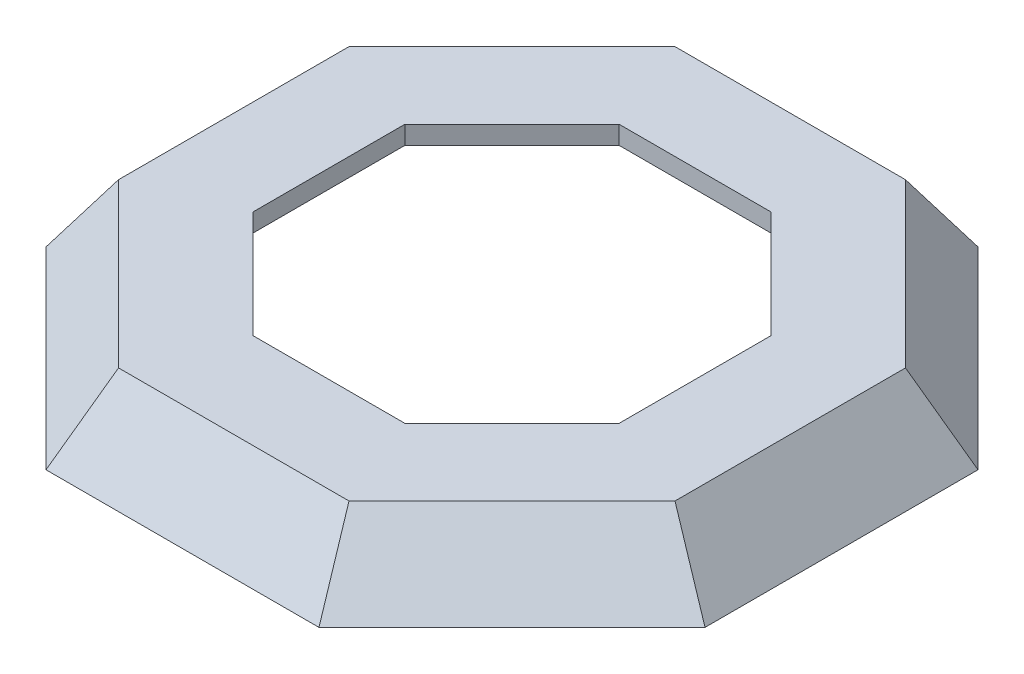
ISO-10303-21;
HEADER;
FILE_DESCRIPTION(('STEP AP214'),'2;1');
FILE_NAME('part.step','',(''),(''),'','','');
FILE_SCHEMA(('AUTOMOTIVE_DESIGN { 1 0 10303 214 1 1 1 1 }'));
ENDSEC;
DATA;
#1=APPLICATION_CONTEXT('core data for automotive mechanical design processes');
#2=APPLICATION_PROTOCOL_DEFINITION('international standard','automotive_design',2000,#1);
#3=PRODUCT_CONTEXT('',#1,'mechanical');
#4=PRODUCT('Part','Part','',(#3));
#5=PRODUCT_RELATED_PRODUCT_CATEGORY('part','',(#4));
#6=PRODUCT_DEFINITION_FORMATION('','',#4);
#7=PRODUCT_DEFINITION_CONTEXT('part definition',#1,'design');
#8=PRODUCT_DEFINITION('design','',#6,#7);
#9=PRODUCT_DEFINITION_SHAPE('','',#8);
#10=(LENGTH_UNIT() NAMED_UNIT(*) SI_UNIT(.MILLI.,.METRE.));
#11=(NAMED_UNIT(*) PLANE_ANGLE_UNIT() SI_UNIT($,.RADIAN.));
#12=(NAMED_UNIT(*) SI_UNIT($,.STERADIAN.) SOLID_ANGLE_UNIT());
#13=UNCERTAINTY_MEASURE_WITH_UNIT(LENGTH_MEASURE(1.E-05),#10,'distance_accuracy_value','');
#14=(GEOMETRIC_REPRESENTATION_CONTEXT(3) GLOBAL_UNCERTAINTY_ASSIGNED_CONTEXT((#13)) GLOBAL_UNIT_ASSIGNED_CONTEXT((#10,
#11,#12)) REPRESENTATION_CONTEXT('',''));
#15=CARTESIAN_POINT('',(0.,0.,0.));
#16=DIRECTION('',(0.,0.,1.));
#17=DIRECTION('',(1.,0.,0.));
#18=AXIS2_PLACEMENT_3D('',#15,#16,#17);
#19=CARTESIAN_POINT('',(0.,20.,0.));
#20=DIRECTION('',(0.,1.,0.));
#21=DIRECTION('',(0.,0.,1.));
#22=AXIS2_PLACEMENT_3D('',#19,#20,#21);
#23=PLANE('',#22);
#24=DIRECTION('',(-0.707106781186548,0.,-0.707106781186547));
#25=VECTOR('',#24,1.);
#26=CARTESIAN_POINT('',(50.,20.,-20.7106781186548));
#27=LINE('',#26,#25);
#28=CARTESIAN_POINT('',(50.,20.,-20.7106781186548));
#29=VERTEX_POINT('',#28);
#30=CARTESIAN_POINT('',(20.7106781186548,20.,-50.));
#31=VERTEX_POINT('',#30);
#32=EDGE_CURVE('E55',#29,#31,#27,.T.);
#33=ORIENTED_EDGE('',*,*,#32,.F.);
#34=DIRECTION('',(0.,0.,-1.));
#35=VECTOR('',#34,1.);
#36=CARTESIAN_POINT('',(50.,20.,20.7106781186548));
#37=LINE('',#36,#35);
#38=CARTESIAN_POINT('',(50.,20.,20.7106781186548));
#39=VERTEX_POINT('',#38);
#40=EDGE_CURVE('E234',#39,#29,#37,.T.);
#41=ORIENTED_EDGE('',*,*,#40,.F.);
#42=DIRECTION('',(0.707106781186547,0.,-0.707106781186548));
#43=VECTOR('',#42,1.);
#44=CARTESIAN_POINT('',(20.7106781186548,20.,50.));
#45=LINE('',#44,#43);
#46=CARTESIAN_POINT('',(20.7106781186548,20.,50.));
#47=VERTEX_POINT('',#46);
#48=EDGE_CURVE('E231',#47,#39,#45,.T.);
#49=ORIENTED_EDGE('',*,*,#48,.F.);
#50=DIRECTION('',(1.,0.,0.));
#51=VECTOR('',#50,1.);
#52=CARTESIAN_POINT('',(-20.7106781186547,20.,50.));
#53=LINE('',#52,#51);
#54=CARTESIAN_POINT('',(-20.7106781186547,20.,50.));
#55=VERTEX_POINT('',#54);
#56=EDGE_CURVE('E228',#55,#47,#53,.T.);
#57=ORIENTED_EDGE('',*,*,#56,.F.);
#58=DIRECTION('',(0.707106781186548,0.,0.707106781186547));
#59=VECTOR('',#58,1.);
#60=CARTESIAN_POINT('',(-50.,20.,20.7106781186548));
#61=LINE('',#60,#59);
#62=CARTESIAN_POINT('',(-50.,20.,20.7106781186548));
#63=VERTEX_POINT('',#62);
#64=EDGE_CURVE('E222',#63,#55,#61,.T.);
#65=ORIENTED_EDGE('',*,*,#64,.F.);
#66=DIRECTION('',(0.,0.,1.));
#67=VECTOR('',#66,1.);
#68=CARTESIAN_POINT('',(-50.,20.,-20.7106781186547));
#69=LINE('',#68,#67);
#70=CARTESIAN_POINT('',(-50.,20.,-20.7106781186547));
#71=VERTEX_POINT('',#70);
#72=EDGE_CURVE('E220',#71,#63,#69,.T.);
#73=ORIENTED_EDGE('',*,*,#72,.F.);
#74=DIRECTION('',(-0.707106781186547,0.,0.707106781186548));
#75=VECTOR('',#74,1.);
#76=CARTESIAN_POINT('',(-20.7106781186548,20.,-50.));
#77=LINE('',#76,#75);
#78=CARTESIAN_POINT('',(-20.7106781186548,20.,-50.));
#79=VERTEX_POINT('',#78);
#80=EDGE_CURVE('E204',#79,#71,#77,.T.);
#81=ORIENTED_EDGE('',*,*,#80,.F.);
#82=DIRECTION('',(-1.,0.,0.));
#83=VECTOR('',#82,1.);
#84=CARTESIAN_POINT('',(20.7106781186548,20.,-50.));
#85=LINE('',#84,#83);
#86=EDGE_CURVE('E213',#31,#79,#85,.T.);
#87=ORIENTED_EDGE('',*,*,#86,.F.);
#88=EDGE_LOOP('',(#33,#41,#49,#57,#65,#73,#81,#87));
#89=FACE_BOUND('',#88,.T.);
#90=DIRECTION('',(0.707106781186548,0.,0.707106781186547));
#91=VECTOR('',#90,1.);
#92=CARTESIAN_POINT('',(-27.376790643458,20.,80.0975700298795));
#93=LINE('',#92,#91);
#94=CARTESIAN_POINT('',(-75.9958492358058,20.,31.4785114375318));
#95=VERTEX_POINT('',#94);
#96=CARTESIAN_POINT('',(-31.4785114375317,20.,75.9958492358058));
#97=VERTEX_POINT('',#96);
#98=EDGE_CURVE('E350',#95,#97,#93,.T.);
#99=ORIENTED_EDGE('',*,*,#98,.T.);
#100=DIRECTION('',(1.,0.,0.));
#101=VECTOR('',#100,1.);
#102=CARTESIAN_POINT('',(37.2792206135786,20.,75.9958492358058));
#103=LINE('',#102,#101);
#104=CARTESIAN_POINT('',(31.4785114375318,20.,75.9958492358058));
#105=VERTEX_POINT('',#104);
#106=EDGE_CURVE('E352',#97,#105,#103,.T.);
#107=ORIENTED_EDGE('',*,*,#106,.T.);
#108=DIRECTION('',(0.707106781186547,0.,-0.707106781186548));
#109=VECTOR('',#108,1.);
#110=CARTESIAN_POINT('',(80.0975700298795,20.,27.3767906434581));
#111=LINE('',#110,#109);
#112=CARTESIAN_POINT('',(75.9958492358059,20.,31.4785114375318));
#113=VERTEX_POINT('',#112);
#114=EDGE_CURVE('E338',#105,#113,#111,.T.);
#115=ORIENTED_EDGE('',*,*,#114,.T.);
#116=DIRECTION('',(0.,0.,-1.));
#117=VECTOR('',#116,1.);
#118=CARTESIAN_POINT('',(75.9958492358058,20.,-37.2792206135786));
#119=LINE('',#118,#117);
#120=CARTESIAN_POINT('',(75.9958492358058,20.,-31.4785114375318));
#121=VERTEX_POINT('',#120);
#122=EDGE_CURVE('E340',#113,#121,#119,.T.);
#123=ORIENTED_EDGE('',*,*,#122,.T.);
#124=DIRECTION('',(-0.707106781186548,0.,-0.707106781186547));
#125=VECTOR('',#124,1.);
#126=CARTESIAN_POINT('',(27.376790643458,20.,-80.0975700298795));
#127=LINE('',#126,#125);
#128=CARTESIAN_POINT('',(31.4785114375317,20.,-75.9958492358058));
#129=VERTEX_POINT('',#128);
#130=EDGE_CURVE('E342',#121,#129,#127,.T.);
#131=ORIENTED_EDGE('',*,*,#130,.T.);
#132=DIRECTION('',(-1.,0.,0.));
#133=VECTOR('',#132,1.);
#134=CARTESIAN_POINT('',(-37.2792206135786,20.,-75.9958492358058));
#135=LINE('',#134,#133);
#136=CARTESIAN_POINT('',(-31.4785114375318,20.,-75.9958492358058));
#137=VERTEX_POINT('',#136);
#138=EDGE_CURVE('E344',#129,#137,#135,.T.);
#139=ORIENTED_EDGE('',*,*,#138,.T.);
#140=DIRECTION('',(-0.707106781186547,0.,0.707106781186548));
#141=VECTOR('',#140,1.);
#142=CARTESIAN_POINT('',(-80.0975700298795,20.,-27.376790643458));
#143=LINE('',#142,#141);
#144=CARTESIAN_POINT('',(-75.9958492358058,20.,-31.4785114375317));
#145=VERTEX_POINT('',#144);
#146=EDGE_CURVE('E346',#137,#145,#143,.T.);
#147=ORIENTED_EDGE('',*,*,#146,.T.);
#148=DIRECTION('',(0.,0.,1.));
#149=VECTOR('',#148,1.);
#150=CARTESIAN_POINT('',(-75.9958492358058,20.,37.2792206135786));
#151=LINE('',#150,#149);
#152=EDGE_CURVE('E348',#145,#95,#151,.T.);
#153=ORIENTED_EDGE('',*,*,#152,.T.);
#154=EDGE_LOOP('',(#99,#107,#115,#123,#131,#139,#147,#153));
#155=FACE_BOUND('',#154,.T.);
#156=ADVANCED_FACE('F39',(#89,#155),#23,.T.);
#157=CARTESIAN_POINT('',(0.,0.,0.));
#158=DIRECTION('',(0.,1.,0.));
#159=DIRECTION('',(0.,0.,1.));
#160=AXIS2_PLACEMENT_3D('',#157,#158,#159);
#161=PLANE('',#160);
#162=DIRECTION('',(1.,0.,0.));
#163=VECTOR('',#162,1.);
#164=CARTESIAN_POINT('',(0.,0.,83.8961270561927));
#165=LINE('',#164,#163);
#166=CARTESIAN_POINT('',(-34.7509136572514,0.,83.8961270561927));
#167=VERTEX_POINT('',#166);
#168=CARTESIAN_POINT('',(34.7509136572514,0.,83.8961270561927));
#169=VERTEX_POINT('',#168);
#170=EDGE_CURVE('E260',#167,#169,#165,.T.);
#171=ORIENTED_EDGE('',*,*,#170,.T.);
#172=DIRECTION('',(0.707106781186547,0.,-0.707106781186548));
#173=VECTOR('',#172,1.);
#174=CARTESIAN_POINT('',(59.3235203567221,0.,59.323520356722));
#175=LINE('',#174,#173);
#176=CARTESIAN_POINT('',(83.8961270561927,0.,34.7509136572514));
#177=VERTEX_POINT('',#176);
#178=EDGE_CURVE('E276',#169,#177,#175,.T.);
#179=ORIENTED_EDGE('',*,*,#178,.T.);
#180=DIRECTION('',(0.,0.,-1.));
#181=VECTOR('',#180,1.);
#182=CARTESIAN_POINT('',(83.8961270561927,0.,0.));
#183=LINE('',#182,#181);
#184=CARTESIAN_POINT('',(83.8961270561927,0.,-34.7509136572514));
#185=VERTEX_POINT('',#184);
#186=EDGE_CURVE('E298',#177,#185,#183,.T.);
#187=ORIENTED_EDGE('',*,*,#186,.T.);
#188=DIRECTION('',(-0.707106781186548,0.,-0.707106781186547));
#189=VECTOR('',#188,1.);
#190=CARTESIAN_POINT('',(59.323520356722,0.,-59.323520356722));
#191=LINE('',#190,#189);
#192=CARTESIAN_POINT('',(34.7509136572513,0.,-83.8961270561927));
#193=VERTEX_POINT('',#192);
#194=EDGE_CURVE('E295',#185,#193,#191,.T.);
#195=ORIENTED_EDGE('',*,*,#194,.T.);
#196=DIRECTION('',(-1.,0.,0.));
#197=VECTOR('',#196,1.);
#198=CARTESIAN_POINT('',(0.,0.,-83.8961270561927));
#199=LINE('',#198,#197);
#200=CARTESIAN_POINT('',(-34.7509136572514,0.,-83.8961270561927));
#201=VERTEX_POINT('',#200);
#202=EDGE_CURVE('E291',#193,#201,#199,.T.);
#203=ORIENTED_EDGE('',*,*,#202,.T.);
#204=DIRECTION('',(-0.707106781186547,0.,0.707106781186548));
#205=VECTOR('',#204,1.);
#206=CARTESIAN_POINT('',(-59.323520356722,0.,-59.323520356722));
#207=LINE('',#206,#205);
#208=CARTESIAN_POINT('',(-83.8961270561927,0.,-34.7509136572514));
#209=VERTEX_POINT('',#208);
#210=EDGE_CURVE('E294',#201,#209,#207,.T.);
#211=ORIENTED_EDGE('',*,*,#210,.T.);
#212=DIRECTION('',(0.,0.,1.));
#213=VECTOR('',#212,1.);
#214=CARTESIAN_POINT('',(-83.8961270561927,0.,0.));
#215=LINE('',#214,#213);
#216=CARTESIAN_POINT('',(-83.8961270561927,0.,34.7509136572514));
#217=VERTEX_POINT('',#216);
#218=EDGE_CURVE('E308',#209,#217,#215,.T.);
#219=ORIENTED_EDGE('',*,*,#218,.T.);
#220=DIRECTION('',(0.707106781186548,0.,0.707106781186547));
#221=VECTOR('',#220,1.);
#222=CARTESIAN_POINT('',(-59.323520356722,0.,59.323520356722));
#223=LINE('',#222,#221);
#224=EDGE_CURVE('E305',#217,#167,#223,.T.);
#225=ORIENTED_EDGE('',*,*,#224,.T.);
#226=EDGE_LOOP('',(#171,#179,#187,#195,#203,#211,#219,#225));
#227=FACE_BOUND('',#226,.T.);
#228=DIRECTION('',(0.707106781186547,0.,-0.707106781186548));
#229=VECTOR('',#228,1.);
#230=CARTESIAN_POINT('',(37.2792206135786,0.,90.));
#231=LINE('',#230,#229);
#232=CARTESIAN_POINT('',(37.2792206135786,0.,90.));
#233=VERTEX_POINT('',#232);
#234=CARTESIAN_POINT('',(90.,0.,37.2792206135785));
#235=VERTEX_POINT('',#234);
#236=EDGE_CURVE('E313',#233,#235,#231,.T.);
#237=ORIENTED_EDGE('',*,*,#236,.F.);
#238=DIRECTION('',(1.,0.,0.));
#239=VECTOR('',#238,1.);
#240=CARTESIAN_POINT('',(-37.2792206135785,0.,90.));
#241=LINE('',#240,#239);
#242=CARTESIAN_POINT('',(-37.2792206135785,0.,90.));
#243=VERTEX_POINT('',#242);
#244=EDGE_CURVE('E335',#243,#233,#241,.T.);
#245=ORIENTED_EDGE('',*,*,#244,.F.);
#246=DIRECTION('',(0.707106781186548,0.,0.707106781186547));
#247=VECTOR('',#246,1.);
#248=CARTESIAN_POINT('',(-90.,0.,37.2792206135786));
#249=LINE('',#248,#247);
#250=CARTESIAN_POINT('',(-90.,0.,37.2792206135786));
#251=VERTEX_POINT('',#250);
#252=EDGE_CURVE('E332',#251,#243,#249,.T.);
#253=ORIENTED_EDGE('',*,*,#252,.F.);
#254=DIRECTION('',(0.,0.,1.));
#255=VECTOR('',#254,1.);
#256=CARTESIAN_POINT('',(-90.,0.,-37.2792206135785));
#257=LINE('',#256,#255);
#258=CARTESIAN_POINT('',(-90.,0.,-37.2792206135785));
#259=VERTEX_POINT('',#258);
#260=EDGE_CURVE('E329',#259,#251,#257,.T.);
#261=ORIENTED_EDGE('',*,*,#260,.F.);
#262=DIRECTION('',(-0.707106781186547,0.,0.707106781186548));
#263=VECTOR('',#262,1.);
#264=CARTESIAN_POINT('',(-37.2792206135786,0.,-90.));
#265=LINE('',#264,#263);
#266=CARTESIAN_POINT('',(-37.2792206135786,0.,-90.));
#267=VERTEX_POINT('',#266);
#268=EDGE_CURVE('E326',#267,#259,#265,.T.);
#269=ORIENTED_EDGE('',*,*,#268,.F.);
#270=DIRECTION('',(-1.,0.,0.));
#271=VECTOR('',#270,1.);
#272=CARTESIAN_POINT('',(37.2792206135785,0.,-90.));
#273=LINE('',#272,#271);
#274=CARTESIAN_POINT('',(37.2792206135785,0.,-90.));
#275=VERTEX_POINT('',#274);
#276=EDGE_CURVE('E323',#275,#267,#273,.T.);
#277=ORIENTED_EDGE('',*,*,#276,.F.);
#278=DIRECTION('',(-0.707106781186548,0.,-0.707106781186547));
#279=VECTOR('',#278,1.);
#280=CARTESIAN_POINT('',(90.,0.,-37.2792206135786));
#281=LINE('',#280,#279);
#282=CARTESIAN_POINT('',(90.,0.,-37.2792206135786));
#283=VERTEX_POINT('',#282);
#284=EDGE_CURVE('E320',#283,#275,#281,.T.);
#285=ORIENTED_EDGE('',*,*,#284,.F.);
#286=DIRECTION('',(0.,0.,-1.));
#287=VECTOR('',#286,1.);
#288=CARTESIAN_POINT('',(90.,0.,37.2792206135785));
#289=LINE('',#288,#287);
#290=EDGE_CURVE('E316',#235,#283,#289,.T.);
#291=ORIENTED_EDGE('',*,*,#290,.F.);
#292=EDGE_LOOP('',(#237,#245,#253,#261,#269,#277,#285,#291));
#293=FACE_BOUND('',#292,.T.);
#294=ADVANCED_FACE('F426',(#227,#293),#161,.F.);
#295=CARTESIAN_POINT('',(0.,20.,-75.9958492358058));
#296=DIRECTION('',(0.,0.573576436351044,-0.819152044288993));
#297=DIRECTION('',(1.,0.,0.));
#298=AXIS2_PLACEMENT_3D('',#295,#296,#297);
#299=PLANE('',#298);
#300=DIRECTION('',(-0.231148998591869,0.79696806571985,0.558043047329448));
#301=VECTOR('',#300,1.);
#302=CARTESIAN_POINT('',(29.7966189925806,25.7989200765185,-71.935401684752));
#303=LINE('',#302,#301);
#304=EDGE_CURVE('E371',#275,#129,#303,.T.);
#305=ORIENTED_EDGE('',*,*,#304,.F.);
#306=ORIENTED_EDGE('',*,*,#276,.T.);
#307=DIRECTION('',(0.231148998591869,0.79696806571985,0.558043047329448));
#308=VECTOR('',#307,1.);
#309=CARTESIAN_POINT('',(-29.7966189925806,25.7989200765185,-71.935401684752));
#310=LINE('',#309,#308);
#311=EDGE_CURVE('E317',#137,#267,#310,.F.);
#312=ORIENTED_EDGE('',*,*,#311,.F.);
#313=ORIENTED_EDGE('',*,*,#138,.F.);
#314=EDGE_LOOP('',(#305,#306,#312,#313));
#315=FACE_BOUND('',#314,.T.);
#316=ADVANCED_FACE('F42',(#315),#299,.T.);
#317=CARTESIAN_POINT('',(-53.7371803366688,20.,-53.7371803366688));
#318=DIRECTION('',(-0.57922796533957,0.573576436351044,-0.57922796533957));
#319=DIRECTION('',(0.707106781186547,0.,-0.707106781186548));
#320=AXIS2_PLACEMENT_3D('',#317,#318,#319);
#321=PLANE('',#320);
#322=ORIENTED_EDGE('',*,*,#311,.T.);
#323=ORIENTED_EDGE('',*,*,#268,.T.);
#324=DIRECTION('',(0.558043047329448,0.79696806571985,0.231148998591869));
#325=VECTOR('',#324,1.);
#326=CARTESIAN_POINT('',(-71.935401684752,25.7989200765185,-29.7966189925806));
#327=LINE('',#326,#325);
#328=EDGE_CURVE('E368',#145,#259,#327,.F.);
#329=ORIENTED_EDGE('',*,*,#328,.F.);
#330=ORIENTED_EDGE('',*,*,#146,.F.);
#331=EDGE_LOOP('',(#322,#323,#329,#330));
#332=FACE_BOUND('',#331,.T.);
#333=ADVANCED_FACE('F476',(#332),#321,.T.);
#334=CARTESIAN_POINT('',(53.7371803366688,20.,-53.7371803366688));
#335=DIRECTION('',(0.57922796533957,0.573576436351044,-0.57922796533957));
#336=DIRECTION('',(0.707106781186548,0.,0.707106781186547));
#337=AXIS2_PLACEMENT_3D('',#334,#335,#336);
#338=PLANE('',#337);
#339=ORIENTED_EDGE('',*,*,#304,.T.);
#340=ORIENTED_EDGE('',*,*,#130,.F.);
#341=DIRECTION('',(-0.558043047329447,0.796968065719851,0.231148998591869));
#342=VECTOR('',#341,1.);
#343=CARTESIAN_POINT('',(71.935401684752,25.7989200765185,-29.7966189925806));
#344=LINE('',#343,#342);
#345=EDGE_CURVE('E365',#283,#121,#344,.T.);
#346=ORIENTED_EDGE('',*,*,#345,.F.);
#347=ORIENTED_EDGE('',*,*,#284,.T.);
#348=EDGE_LOOP('',(#339,#340,#346,#347));
#349=FACE_BOUND('',#348,.T.);
#350=ADVANCED_FACE('F470',(#349),#338,.T.);
#351=CARTESIAN_POINT('',(-75.9958492358058,20.,0.));
#352=DIRECTION('',(-0.819152044288993,0.573576436351044,0.));
#353=DIRECTION('',(0.,0.,-1.));
#354=AXIS2_PLACEMENT_3D('',#351,#352,#353);
#355=PLANE('',#354);
#356=ORIENTED_EDGE('',*,*,#328,.T.);
#357=ORIENTED_EDGE('',*,*,#260,.T.);
#358=DIRECTION('',(0.558043047329448,0.79696806571985,-0.231148998591869));
#359=VECTOR('',#358,1.);
#360=CARTESIAN_POINT('',(-71.935401684752,25.7989200765185,29.7966189925806));
#361=LINE('',#360,#359);
#362=EDGE_CURVE('E362',#95,#251,#361,.F.);
#363=ORIENTED_EDGE('',*,*,#362,.F.);
#364=ORIENTED_EDGE('',*,*,#152,.F.);
#365=EDGE_LOOP('',(#356,#357,#363,#364));
#366=FACE_BOUND('',#365,.T.);
#367=ADVANCED_FACE('F463',(#366),#355,.T.);
#368=CARTESIAN_POINT('',(75.9958492358058,20.,0.));
#369=DIRECTION('',(0.819152044288993,0.573576436351044,0.));
#370=DIRECTION('',(0.,0.,1.));
#371=AXIS2_PLACEMENT_3D('',#368,#369,#370);
#372=PLANE('',#371);
#373=ORIENTED_EDGE('',*,*,#345,.T.);
#374=ORIENTED_EDGE('',*,*,#122,.F.);
#375=DIRECTION('',(-0.558043047329448,0.796968065719851,-0.231148998591869));
#376=VECTOR('',#375,1.);
#377=CARTESIAN_POINT('',(71.935401684752,25.7989200765185,29.7966189925806));
#378=LINE('',#377,#376);
#379=EDGE_CURVE('E359',#235,#113,#378,.T.);
#380=ORIENTED_EDGE('',*,*,#379,.F.);
#381=ORIENTED_EDGE('',*,*,#290,.T.);
#382=EDGE_LOOP('',(#373,#374,#380,#381));
#383=FACE_BOUND('',#382,.T.);
#384=ADVANCED_FACE('F456',(#383),#372,.T.);
#385=CARTESIAN_POINT('',(-53.7371803366688,20.,53.7371803366688));
#386=DIRECTION('',(-0.57922796533957,0.573576436351044,0.57922796533957));
#387=DIRECTION('',(-0.707106781186548,0.,-0.707106781186547));
#388=AXIS2_PLACEMENT_3D('',#385,#386,#387);
#389=PLANE('',#388);
#390=ORIENTED_EDGE('',*,*,#362,.T.);
#391=ORIENTED_EDGE('',*,*,#252,.T.);
#392=DIRECTION('',(0.231148998591869,0.796968065719851,-0.558043047329447));
#393=VECTOR('',#392,1.);
#394=CARTESIAN_POINT('',(-29.7966189925806,25.7989200765185,71.935401684752));
#395=LINE('',#394,#393);
#396=EDGE_CURVE('E357',#97,#243,#395,.F.);
#397=ORIENTED_EDGE('',*,*,#396,.F.);
#398=ORIENTED_EDGE('',*,*,#98,.F.);
#399=EDGE_LOOP('',(#390,#391,#397,#398));
#400=FACE_BOUND('',#399,.T.);
#401=ADVANCED_FACE('F449',(#400),#389,.T.);
#402=CARTESIAN_POINT('',(53.7371803366688,20.,53.7371803366688));
#403=DIRECTION('',(0.57922796533957,0.573576436351044,0.57922796533957));
#404=DIRECTION('',(-0.707106781186547,0.,0.707106781186548));
#405=AXIS2_PLACEMENT_3D('',#402,#403,#404);
#406=PLANE('',#405);
#407=ORIENTED_EDGE('',*,*,#379,.T.);
#408=ORIENTED_EDGE('',*,*,#114,.F.);
#409=DIRECTION('',(0.231148998591869,-0.796968065719851,0.558043047329447));
#410=VECTOR('',#409,1.);
#411=CARTESIAN_POINT('',(29.7966189925807,25.7989200765185,71.935401684752));
#412=LINE('',#411,#410);
#413=EDGE_CURVE('E256',#233,#105,#412,.F.);
#414=ORIENTED_EDGE('',*,*,#413,.F.);
#415=ORIENTED_EDGE('',*,*,#236,.T.);
#416=EDGE_LOOP('',(#407,#408,#414,#415));
#417=FACE_BOUND('',#416,.T.);
#418=ADVANCED_FACE('F442',(#417),#406,.T.);
#419=CARTESIAN_POINT('',(0.,20.,75.9958492358058));
#420=DIRECTION('',(0.,0.573576436351044,0.819152044288993));
#421=DIRECTION('',(-1.,0.,0.));
#422=AXIS2_PLACEMENT_3D('',#419,#420,#421);
#423=PLANE('',#422);
#424=ORIENTED_EDGE('',*,*,#396,.T.);
#425=ORIENTED_EDGE('',*,*,#244,.T.);
#426=ORIENTED_EDGE('',*,*,#413,.T.);
#427=ORIENTED_EDGE('',*,*,#106,.F.);
#428=EDGE_LOOP('',(#424,#425,#426,#427));
#429=FACE_BOUND('',#428,.T.);
#430=ADVANCED_FACE('F436',(#429),#423,.T.);
#431=CARTESIAN_POINT('',(0.,15.,0.));
#432=DIRECTION('',(0.,1.,0.));
#433=DIRECTION('',(0.,0.,1.));
#434=AXIS2_PLACEMENT_3D('',#431,#432,#433);
#435=PLANE('',#434);
#436=DIRECTION('',(0.,0.,-1.));
#437=VECTOR('',#436,1.);
#438=CARTESIAN_POINT('',(50.,15.,0.));
#439=LINE('',#438,#437);
#440=CARTESIAN_POINT('',(50.,15.,20.7106781186548));
#441=VERTEX_POINT('',#440);
#442=CARTESIAN_POINT('',(50.,15.,-20.7106781186548));
#443=VERTEX_POINT('',#442);
#444=EDGE_CURVE('E48',#441,#443,#439,.T.);
#445=ORIENTED_EDGE('',*,*,#444,.T.);
#446=DIRECTION('',(-0.707106781186548,0.,-0.707106781186547));
#447=VECTOR('',#446,1.);
#448=CARTESIAN_POINT('',(35.3553390593274,15.,-35.3553390593274));
#449=LINE('',#448,#447);
#450=CARTESIAN_POINT('',(20.7106781186548,15.,-50.));
#451=VERTEX_POINT('',#450);
#452=EDGE_CURVE('E11',#443,#451,#449,.T.);
#453=ORIENTED_EDGE('',*,*,#452,.T.);
#454=DIRECTION('',(-1.,0.,0.));
#455=VECTOR('',#454,1.);
#456=CARTESIAN_POINT('',(0.,15.,-50.));
#457=LINE('',#456,#455);
#458=CARTESIAN_POINT('',(-20.7106781186548,15.,-50.));
#459=VERTEX_POINT('',#458);
#460=EDGE_CURVE('E355',#451,#459,#457,.T.);
#461=ORIENTED_EDGE('',*,*,#460,.T.);
#462=DIRECTION('',(-0.707106781186547,0.,0.707106781186548));
#463=VECTOR('',#462,1.);
#464=CARTESIAN_POINT('',(-35.3553390593274,15.,-35.3553390593274));
#465=LINE('',#464,#463);
#466=CARTESIAN_POINT('',(-50.,15.,-20.7106781186547));
#467=VERTEX_POINT('',#466);
#468=EDGE_CURVE('E207',#459,#467,#465,.T.);
#469=ORIENTED_EDGE('',*,*,#468,.T.);
#470=DIRECTION('',(0.,0.,1.));
#471=VECTOR('',#470,1.);
#472=CARTESIAN_POINT('',(-50.,15.,0.));
#473=LINE('',#472,#471);
#474=CARTESIAN_POINT('',(-50.,15.,20.7106781186548));
#475=VERTEX_POINT('',#474);
#476=EDGE_CURVE('E378',#467,#475,#473,.T.);
#477=ORIENTED_EDGE('',*,*,#476,.T.);
#478=DIRECTION('',(0.707106781186548,0.,0.707106781186547));
#479=VECTOR('',#478,1.);
#480=CARTESIAN_POINT('',(-35.3553390593274,15.,35.3553390593274));
#481=LINE('',#480,#479);
#482=CARTESIAN_POINT('',(-20.7106781186547,15.,50.));
#483=VERTEX_POINT('',#482);
#484=EDGE_CURVE('E381',#475,#483,#481,.T.);
#485=ORIENTED_EDGE('',*,*,#484,.T.);
#486=DIRECTION('',(1.,0.,0.));
#487=VECTOR('',#486,1.);
#488=CARTESIAN_POINT('',(0.,15.,50.));
#489=LINE('',#488,#487);
#490=CARTESIAN_POINT('',(20.7106781186548,15.,50.));
#491=VERTEX_POINT('',#490);
#492=EDGE_CURVE('E384',#483,#491,#489,.T.);
#493=ORIENTED_EDGE('',*,*,#492,.T.);
#494=DIRECTION('',(0.707106781186547,0.,-0.707106781186548));
#495=VECTOR('',#494,1.);
#496=CARTESIAN_POINT('',(35.3553390593274,15.,35.3553390593274));
#497=LINE('',#496,#495);
#498=EDGE_CURVE('E387',#491,#441,#497,.T.);
#499=ORIENTED_EDGE('',*,*,#498,.T.);
#500=EDGE_LOOP('',(#445,#453,#461,#469,#477,#485,#493,#499));
#501=FACE_BOUND('',#500,.T.);
#502=DIRECTION('',(0.707106781186548,0.,0.707106781186547));
#503=VECTOR('',#502,1.);
#504=CARTESIAN_POINT('',(-51.8966978791317,15.,51.8966978791317));
#505=LINE('',#504,#503);
#506=CARTESIAN_POINT('',(-73.3930139830471,15.,30.4003817752163));
#507=VERTEX_POINT('',#506);
#508=CARTESIAN_POINT('',(-30.4003817752163,15.,73.3930139830471));
#509=VERTEX_POINT('',#508);
#510=EDGE_CURVE('E250',#507,#509,#505,.T.);
#511=ORIENTED_EDGE('',*,*,#510,.F.);
#512=DIRECTION('',(0.,0.,1.));
#513=VECTOR('',#512,1.);
#514=CARTESIAN_POINT('',(-73.3930139830471,15.,0.));
#515=LINE('',#514,#513);
#516=CARTESIAN_POINT('',(-73.3930139830471,15.,-30.4003817752163));
#517=VERTEX_POINT('',#516);
#518=EDGE_CURVE('E253',#517,#507,#515,.T.);
#519=ORIENTED_EDGE('',*,*,#518,.F.);
#520=DIRECTION('',(-0.707106781186547,0.,0.707106781186548));
#521=VECTOR('',#520,1.);
#522=CARTESIAN_POINT('',(-51.8966978791317,15.,-51.8966978791317));
#523=LINE('',#522,#521);
#524=CARTESIAN_POINT('',(-30.4003817752163,15.,-73.3930139830471));
#525=VERTEX_POINT('',#524);
#526=EDGE_CURVE('E266',#525,#517,#523,.T.);
#527=ORIENTED_EDGE('',*,*,#526,.F.);
#528=DIRECTION('',(-1.,0.,0.));
#529=VECTOR('',#528,1.);
#530=CARTESIAN_POINT('',(0.,15.,-73.3930139830471));
#531=LINE('',#530,#529);
#532=CARTESIAN_POINT('',(30.4003817752163,15.,-73.3930139830471));
#533=VERTEX_POINT('',#532);
#534=EDGE_CURVE('E264',#533,#525,#531,.T.);
#535=ORIENTED_EDGE('',*,*,#534,.F.);
#536=DIRECTION('',(-0.707106781186548,0.,-0.707106781186547));
#537=VECTOR('',#536,1.);
#538=CARTESIAN_POINT('',(51.8966978791317,15.,-51.8966978791317));
#539=LINE('',#538,#537);
#540=CARTESIAN_POINT('',(73.3930139830471,15.,-30.4003817752163));
#541=VERTEX_POINT('',#540);
#542=EDGE_CURVE('E262',#541,#533,#539,.T.);
#543=ORIENTED_EDGE('',*,*,#542,.F.);
#544=DIRECTION('',(0.,0.,-1.));
#545=VECTOR('',#544,1.);
#546=CARTESIAN_POINT('',(73.3930139830471,15.,0.));
#547=LINE('',#546,#545);
#548=CARTESIAN_POINT('',(73.3930139830471,15.,30.4003817752163));
#549=VERTEX_POINT('',#548);
#550=EDGE_CURVE('E259',#549,#541,#547,.T.);
#551=ORIENTED_EDGE('',*,*,#550,.F.);
#552=DIRECTION('',(0.707106781186547,0.,-0.707106781186548));
#553=VECTOR('',#552,1.);
#554=CARTESIAN_POINT('',(51.8966978791317,15.,51.8966978791317));
#555=LINE('',#554,#553);
#556=CARTESIAN_POINT('',(30.4003817752163,15.,73.3930139830471));
#557=VERTEX_POINT('',#556);
#558=EDGE_CURVE('E257',#557,#549,#555,.T.);
#559=ORIENTED_EDGE('',*,*,#558,.F.);
#560=DIRECTION('',(1.,0.,0.));
#561=VECTOR('',#560,1.);
#562=CARTESIAN_POINT('',(0.,15.,73.3930139830471));
#563=LINE('',#562,#561);
#564=EDGE_CURVE('E252',#509,#557,#563,.T.);
#565=ORIENTED_EDGE('',*,*,#564,.F.);
#566=EDGE_LOOP('',(#511,#519,#527,#535,#543,#551,#559,#565));
#567=FACE_BOUND('',#566,.T.);
#568=ADVANCED_FACE('F391',(#501,#567),#435,.F.);
#569=CARTESIAN_POINT('',(0.,17.1321178182448,-71.9000890143609));
#570=DIRECTION('',(0.,0.573576436351044,-0.819152044288993));
#571=DIRECTION('',(1.,0.,0.));
#572=AXIS2_PLACEMENT_3D('',#569,#570,#571);
#573=PLANE('',#572);
#574=DIRECTION('',(-0.231148998591869,0.79696806571985,0.558043047329448));
#575=VECTOR('',#574,1.);
#576=CARTESIAN_POINT('',(28.1907443556029,22.6185078498256,-68.0584773566894));
#577=LINE('',#576,#575);
#578=EDGE_CURVE('E269',#193,#533,#577,.T.);
#579=ORIENTED_EDGE('',*,*,#578,.T.);
#580=ORIENTED_EDGE('',*,*,#534,.T.);
#581=DIRECTION('',(-0.231148998591869,-0.79696806571985,-0.558043047329448));
#582=VECTOR('',#581,1.);
#583=CARTESIAN_POINT('',(-28.1907443556029,22.6185078498256,-68.0584773566894));
#584=LINE('',#583,#582);
#585=EDGE_CURVE('E272',#525,#201,#584,.T.);
#586=ORIENTED_EDGE('',*,*,#585,.T.);
#587=ORIENTED_EDGE('',*,*,#202,.F.);
#588=EDGE_LOOP('',(#579,#580,#586,#587));
#589=FACE_BOUND('',#588,.T.);
#590=ADVANCED_FACE('F520',(#589),#573,.F.);
#591=CARTESIAN_POINT('',(-50.841040509971,17.1321178182448,-50.8410405099709));
#592=DIRECTION('',(-0.57922796533957,0.573576436351044,-0.57922796533957));
#593=DIRECTION('',(0.707106781186547,0.,-0.707106781186548));
#594=AXIS2_PLACEMENT_3D('',#591,#592,#593);
#595=PLANE('',#594);
#596=ORIENTED_EDGE('',*,*,#585,.F.);
#597=ORIENTED_EDGE('',*,*,#526,.T.);
#598=DIRECTION('',(-0.558043047329448,-0.79696806571985,-0.231148998591869));
#599=VECTOR('',#598,1.);
#600=CARTESIAN_POINT('',(-68.0584773566894,22.6185078498256,-28.1907443556029));
#601=LINE('',#600,#599);
#602=EDGE_CURVE('E273',#517,#209,#601,.T.);
#603=ORIENTED_EDGE('',*,*,#602,.T.);
#604=ORIENTED_EDGE('',*,*,#210,.F.);
#605=EDGE_LOOP('',(#596,#597,#603,#604));
#606=FACE_BOUND('',#605,.T.);
#607=ADVANCED_FACE('F525',(#606),#595,.F.);
#608=CARTESIAN_POINT('',(50.8410405099709,17.1321178182448,-50.841040509971));
#609=DIRECTION('',(0.57922796533957,0.573576436351044,-0.57922796533957));
#610=DIRECTION('',(0.707106781186548,0.,0.707106781186547));
#611=AXIS2_PLACEMENT_3D('',#608,#609,#610);
#612=PLANE('',#611);
#613=ORIENTED_EDGE('',*,*,#578,.F.);
#614=ORIENTED_EDGE('',*,*,#194,.F.);
#615=DIRECTION('',(-0.558043047329447,0.796968065719851,0.231148998591869));
#616=VECTOR('',#615,1.);
#617=CARTESIAN_POINT('',(68.0584773566894,22.6185078498256,-28.1907443556029));
#618=LINE('',#617,#616);
#619=EDGE_CURVE('E279',#185,#541,#618,.T.);
#620=ORIENTED_EDGE('',*,*,#619,.T.);
#621=ORIENTED_EDGE('',*,*,#542,.T.);
#622=EDGE_LOOP('',(#613,#614,#620,#621));
#623=FACE_BOUND('',#622,.T.);
#624=ADVANCED_FACE('F537',(#623),#612,.F.);
#625=CARTESIAN_POINT('',(-71.9000890143609,17.1321178182448,0.));
#626=DIRECTION('',(-0.819152044288993,0.573576436351044,0.));
#627=DIRECTION('',(0.,0.,-1.));
#628=AXIS2_PLACEMENT_3D('',#625,#626,#627);
#629=PLANE('',#628);
#630=ORIENTED_EDGE('',*,*,#602,.F.);
#631=ORIENTED_EDGE('',*,*,#518,.T.);
#632=DIRECTION('',(-0.558043047329448,-0.79696806571985,0.231148998591869));
#633=VECTOR('',#632,1.);
#634=CARTESIAN_POINT('',(-68.0584773566894,22.6185078498256,28.1907443556029));
#635=LINE('',#634,#633);
#636=EDGE_CURVE('E280',#507,#217,#635,.T.);
#637=ORIENTED_EDGE('',*,*,#636,.T.);
#638=ORIENTED_EDGE('',*,*,#218,.F.);
#639=EDGE_LOOP('',(#630,#631,#637,#638));
#640=FACE_BOUND('',#639,.T.);
#641=ADVANCED_FACE('F547',(#640),#629,.F.);
#642=CARTESIAN_POINT('',(71.9000890143609,17.1321178182448,0.));
#643=DIRECTION('',(0.819152044288993,0.573576436351044,0.));
#644=DIRECTION('',(0.,0.,1.));
#645=AXIS2_PLACEMENT_3D('',#642,#643,#644);
#646=PLANE('',#645);
#647=ORIENTED_EDGE('',*,*,#619,.F.);
#648=ORIENTED_EDGE('',*,*,#186,.F.);
#649=DIRECTION('',(-0.558043047329448,0.796968065719851,-0.231148998591869));
#650=VECTOR('',#649,1.);
#651=CARTESIAN_POINT('',(68.0584773566894,22.6185078498256,28.1907443556029));
#652=LINE('',#651,#650);
#653=EDGE_CURVE('E283',#177,#549,#652,.T.);
#654=ORIENTED_EDGE('',*,*,#653,.T.);
#655=ORIENTED_EDGE('',*,*,#550,.T.);
#656=EDGE_LOOP('',(#647,#648,#654,#655));
#657=FACE_BOUND('',#656,.T.);
#658=ADVANCED_FACE('F557',(#657),#646,.F.);
#659=CARTESIAN_POINT('',(-50.8410405099709,17.1321178182448,50.841040509971));
#660=DIRECTION('',(-0.57922796533957,0.573576436351044,0.57922796533957));
#661=DIRECTION('',(-0.707106781186548,0.,-0.707106781186547));
#662=AXIS2_PLACEMENT_3D('',#659,#660,#661);
#663=PLANE('',#662);
#664=ORIENTED_EDGE('',*,*,#636,.F.);
#665=ORIENTED_EDGE('',*,*,#510,.T.);
#666=DIRECTION('',(-0.231148998591869,-0.796968065719851,0.558043047329448));
#667=VECTOR('',#666,1.);
#668=CARTESIAN_POINT('',(-28.1907443556029,22.6185078498256,68.0584773566894));
#669=LINE('',#668,#667);
#670=EDGE_CURVE('E284',#509,#167,#669,.T.);
#671=ORIENTED_EDGE('',*,*,#670,.T.);
#672=ORIENTED_EDGE('',*,*,#224,.F.);
#673=EDGE_LOOP('',(#664,#665,#671,#672));
#674=FACE_BOUND('',#673,.T.);
#675=ADVANCED_FACE('F567',(#674),#663,.F.);
#676=CARTESIAN_POINT('',(50.841040509971,17.1321178182448,50.841040509971));
#677=DIRECTION('',(0.57922796533957,0.573576436351044,0.57922796533957));
#678=DIRECTION('',(-0.707106781186547,0.,0.707106781186548));
#679=AXIS2_PLACEMENT_3D('',#676,#677,#678);
#680=PLANE('',#679);
#681=ORIENTED_EDGE('',*,*,#653,.F.);
#682=ORIENTED_EDGE('',*,*,#178,.F.);
#683=DIRECTION('',(-0.231148998591869,0.796968065719851,-0.558043047329447));
#684=VECTOR('',#683,1.);
#685=CARTESIAN_POINT('',(28.1907443556029,22.6185078498256,68.0584773566894));
#686=LINE('',#685,#684);
#687=EDGE_CURVE('E239',#169,#557,#686,.T.);
#688=ORIENTED_EDGE('',*,*,#687,.T.);
#689=ORIENTED_EDGE('',*,*,#558,.T.);
#690=EDGE_LOOP('',(#681,#682,#688,#689));
#691=FACE_BOUND('',#690,.T.);
#692=ADVANCED_FACE('F420',(#691),#680,.F.);
#693=CARTESIAN_POINT('',(0.,17.1321178182448,71.9000890143609));
#694=DIRECTION('',(0.,0.573576436351044,0.819152044288993));
#695=DIRECTION('',(-1.,0.,0.));
#696=AXIS2_PLACEMENT_3D('',#693,#694,#695);
#697=PLANE('',#696);
#698=ORIENTED_EDGE('',*,*,#670,.F.);
#699=ORIENTED_EDGE('',*,*,#564,.T.);
#700=ORIENTED_EDGE('',*,*,#687,.F.);
#701=ORIENTED_EDGE('',*,*,#170,.F.);
#702=EDGE_LOOP('',(#698,#699,#700,#701));
#703=FACE_BOUND('',#702,.T.);
#704=ADVANCED_FACE('F413',(#703),#697,.F.);
#705=CARTESIAN_POINT('',(50.,0.,-20.7106781186548));
#706=DIRECTION('',(0.707106781186547,0.,-0.707106781186548));
#707=DIRECTION('',(-0.707106781186548,0.,-0.707106781186547));
#708=AXIS2_PLACEMENT_3D('',#705,#706,#707);
#709=PLANE('',#708);
#710=DIRECTION('',(0.,1.,0.));
#711=VECTOR('',#710,1.);
#712=CARTESIAN_POINT('',(50.,0.,-20.7106781186548));
#713=LINE('',#712,#711);
#714=EDGE_CURVE('E237',#443,#29,#713,.T.);
#715=ORIENTED_EDGE('',*,*,#714,.T.);
#716=ORIENTED_EDGE('',*,*,#32,.T.);
#717=DIRECTION('',(0.,1.,0.));
#718=VECTOR('',#717,1.);
#719=CARTESIAN_POINT('',(20.7106781186548,0.,-50.));
#720=LINE('',#719,#718);
#721=EDGE_CURVE('E210',#451,#31,#720,.T.);
#722=ORIENTED_EDGE('',*,*,#721,.F.);
#723=ORIENTED_EDGE('',*,*,#452,.F.);
#724=EDGE_LOOP('',(#715,#716,#722,#723));
#725=FACE_BOUND('',#724,.T.);
#726=ADVANCED_FACE('F411',(#725),#709,.F.);
#727=CARTESIAN_POINT('',(50.,0.,20.7106781186548));
#728=DIRECTION('',(1.,0.,0.));
#729=DIRECTION('',(0.,0.,-1.));
#730=AXIS2_PLACEMENT_3D('',#727,#728,#729);
#731=PLANE('',#730);
#732=DIRECTION('',(0.,1.,0.));
#733=VECTOR('',#732,1.);
#734=CARTESIAN_POINT('',(50.,0.,20.7106781186548));
#735=LINE('',#734,#733);
#736=EDGE_CURVE('E240',#441,#39,#735,.T.);
#737=ORIENTED_EDGE('',*,*,#736,.T.);
#738=ORIENTED_EDGE('',*,*,#40,.T.);
#739=ORIENTED_EDGE('',*,*,#714,.F.);
#740=ORIENTED_EDGE('',*,*,#444,.F.);
#741=EDGE_LOOP('',(#737,#738,#739,#740));
#742=FACE_BOUND('',#741,.T.);
#743=ADVANCED_FACE('F396',(#742),#731,.F.);
#744=CARTESIAN_POINT('',(20.7106781186548,0.,50.));
#745=DIRECTION('',(0.707106781186548,0.,0.707106781186547));
#746=DIRECTION('',(0.707106781186547,0.,-0.707106781186548));
#747=AXIS2_PLACEMENT_3D('',#744,#745,#746);
#748=PLANE('',#747);
#749=DIRECTION('',(0.,1.,0.));
#750=VECTOR('',#749,1.);
#751=CARTESIAN_POINT('',(20.7106781186548,0.,50.));
#752=LINE('',#751,#750);
#753=EDGE_CURVE('E242',#491,#47,#752,.T.);
#754=ORIENTED_EDGE('',*,*,#753,.T.);
#755=ORIENTED_EDGE('',*,*,#48,.T.);
#756=ORIENTED_EDGE('',*,*,#736,.F.);
#757=ORIENTED_EDGE('',*,*,#498,.F.);
#758=EDGE_LOOP('',(#754,#755,#756,#757));
#759=FACE_BOUND('',#758,.T.);
#760=ADVANCED_FACE('F398',(#759),#748,.F.);
#761=CARTESIAN_POINT('',(-20.7106781186547,0.,50.));
#762=DIRECTION('',(0.,0.,1.));
#763=DIRECTION('',(1.,0.,0.));
#764=AXIS2_PLACEMENT_3D('',#761,#762,#763);
#765=PLANE('',#764);
#766=DIRECTION('',(0.,1.,0.));
#767=VECTOR('',#766,1.);
#768=CARTESIAN_POINT('',(-20.7106781186547,0.,50.));
#769=LINE('',#768,#767);
#770=EDGE_CURVE('E244',#483,#55,#769,.T.);
#771=ORIENTED_EDGE('',*,*,#770,.T.);
#772=ORIENTED_EDGE('',*,*,#56,.T.);
#773=ORIENTED_EDGE('',*,*,#753,.F.);
#774=ORIENTED_EDGE('',*,*,#492,.F.);
#775=EDGE_LOOP('',(#771,#772,#773,#774));
#776=FACE_BOUND('',#775,.T.);
#777=ADVANCED_FACE('F404',(#776),#765,.F.);
#778=CARTESIAN_POINT('',(-50.,0.,20.7106781186548));
#779=DIRECTION('',(-0.707106781186547,0.,0.707106781186548));
#780=DIRECTION('',(0.707106781186548,0.,0.707106781186547));
#781=AXIS2_PLACEMENT_3D('',#778,#779,#780);
#782=PLANE('',#781);
#783=DIRECTION('',(0.,1.,0.));
#784=VECTOR('',#783,1.);
#785=CARTESIAN_POINT('',(-50.,0.,20.7106781186548));
#786=LINE('',#785,#784);
#787=EDGE_CURVE('E246',#475,#63,#786,.T.);
#788=ORIENTED_EDGE('',*,*,#787,.T.);
#789=ORIENTED_EDGE('',*,*,#64,.T.);
#790=ORIENTED_EDGE('',*,*,#770,.F.);
#791=ORIENTED_EDGE('',*,*,#484,.F.);
#792=EDGE_LOOP('',(#788,#789,#790,#791));
#793=FACE_BOUND('',#792,.T.);
#794=ADVANCED_FACE('F407',(#793),#782,.F.);
#795=CARTESIAN_POINT('',(-50.,0.,-20.7106781186547));
#796=DIRECTION('',(-1.,0.,0.));
#797=DIRECTION('',(0.,0.,1.));
#798=AXIS2_PLACEMENT_3D('',#795,#796,#797);
#799=PLANE('',#798);
#800=DIRECTION('',(0.,1.,0.));
#801=VECTOR('',#800,1.);
#802=CARTESIAN_POINT('',(-50.,0.,-20.7106781186547));
#803=LINE('',#802,#801);
#804=EDGE_CURVE('E209',#467,#71,#803,.T.);
#805=ORIENTED_EDGE('',*,*,#804,.T.);
#806=ORIENTED_EDGE('',*,*,#72,.T.);
#807=ORIENTED_EDGE('',*,*,#787,.F.);
#808=ORIENTED_EDGE('',*,*,#476,.F.);
#809=EDGE_LOOP('',(#805,#806,#807,#808));
#810=FACE_BOUND('',#809,.T.);
#811=ADVANCED_FACE('F410',(#810),#799,.F.);
#812=CARTESIAN_POINT('',(-20.7106781186548,0.,-50.));
#813=DIRECTION('',(-0.707106781186548,0.,-0.707106781186547));
#814=DIRECTION('',(-0.707106781186547,0.,0.707106781186548));
#815=AXIS2_PLACEMENT_3D('',#812,#813,#814);
#816=PLANE('',#815);
#817=DIRECTION('',(0.,1.,0.));
#818=VECTOR('',#817,1.);
#819=CARTESIAN_POINT('',(-20.7106781186548,0.,-50.));
#820=LINE('',#819,#818);
#821=EDGE_CURVE('E63',#459,#79,#820,.T.);
#822=ORIENTED_EDGE('',*,*,#821,.T.);
#823=ORIENTED_EDGE('',*,*,#80,.T.);
#824=ORIENTED_EDGE('',*,*,#804,.F.);
#825=ORIENTED_EDGE('',*,*,#468,.F.);
#826=EDGE_LOOP('',(#822,#823,#824,#825));
#827=FACE_BOUND('',#826,.T.);
#828=ADVANCED_FACE('F201',(#827),#816,.F.);
#829=CARTESIAN_POINT('',(20.7106781186548,0.,-50.));
#830=DIRECTION('',(0.,0.,-1.));
#831=DIRECTION('',(-1.,0.,0.));
#832=AXIS2_PLACEMENT_3D('',#829,#830,#831);
#833=PLANE('',#832);
#834=ORIENTED_EDGE('',*,*,#721,.T.);
#835=ORIENTED_EDGE('',*,*,#86,.T.);
#836=ORIENTED_EDGE('',*,*,#821,.F.);
#837=ORIENTED_EDGE('',*,*,#460,.F.);
#838=EDGE_LOOP('',(#834,#835,#836,#837));
#839=FACE_BOUND('',#838,.T.);
#840=ADVANCED_FACE('F214',(#839),#833,.F.);
#841=CLOSED_SHELL('',(#156,#294,#316,#333,#350,#367,#384,#401,#418,#430,#568,#590,#607,#624,
#641,#658,#675,#692,#704,#726,#743,#760,#777,#794,#811,#828,#840));
#842=MANIFOLD_SOLID_BREP('B2',#841);
#843=ADVANCED_BREP_SHAPE_REPRESENTATION('',(#18,#842),#14);
#844=SHAPE_DEFINITION_REPRESENTATION(#9,#843);
ENDSEC;
END-ISO-10303-21;
